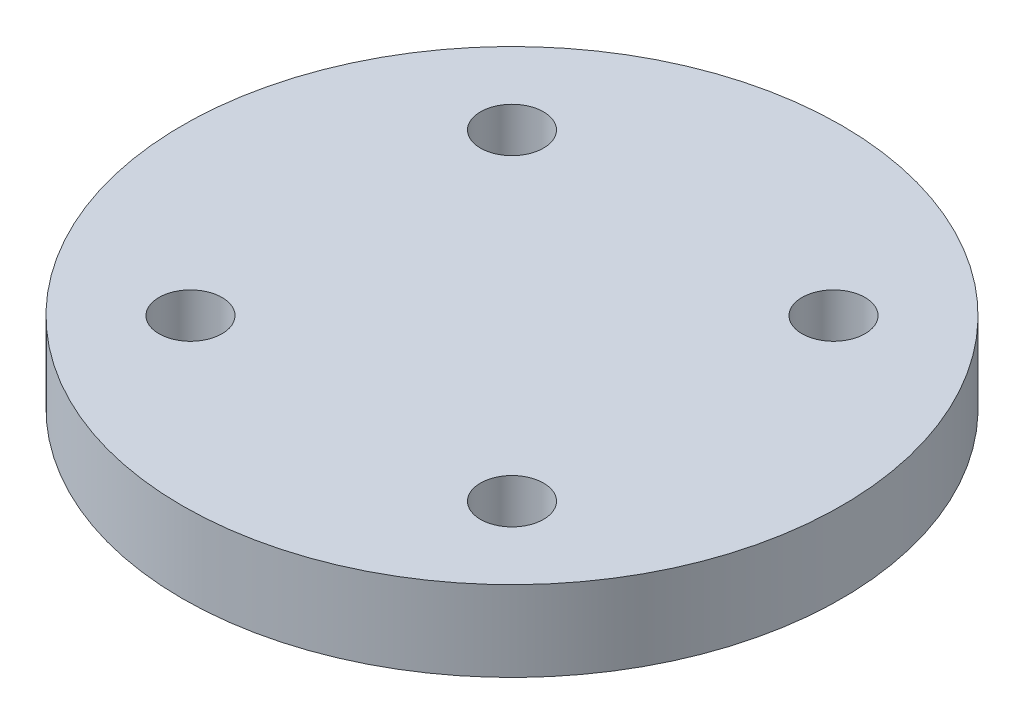
ISO-10303-21;
HEADER;
FILE_DESCRIPTION(('STEP AP214'),'2;1');
FILE_NAME('part.step','',(''),(''),'','','');
FILE_SCHEMA(('AUTOMOTIVE_DESIGN { 1 0 10303 214 1 1 1 1 }'));
ENDSEC;
DATA;
#1=APPLICATION_CONTEXT('core data for automotive mechanical design processes');
#2=APPLICATION_PROTOCOL_DEFINITION('international standard','automotive_design',2000,#1);
#3=PRODUCT_CONTEXT('',#1,'mechanical');
#4=PRODUCT('Part','Part','',(#3));
#5=PRODUCT_RELATED_PRODUCT_CATEGORY('part','',(#4));
#6=PRODUCT_DEFINITION_FORMATION('','',#4);
#7=PRODUCT_DEFINITION_CONTEXT('part definition',#1,'design');
#8=PRODUCT_DEFINITION('design','',#6,#7);
#9=PRODUCT_DEFINITION_SHAPE('','',#8);
#10=(LENGTH_UNIT() NAMED_UNIT(*) SI_UNIT(.MILLI.,.METRE.));
#11=(NAMED_UNIT(*) PLANE_ANGLE_UNIT() SI_UNIT($,.RADIAN.));
#12=(NAMED_UNIT(*) SI_UNIT($,.STERADIAN.) SOLID_ANGLE_UNIT());
#13=UNCERTAINTY_MEASURE_WITH_UNIT(LENGTH_MEASURE(1.E-05),#10,'distance_accuracy_value','');
#14=(GEOMETRIC_REPRESENTATION_CONTEXT(3) GLOBAL_UNCERTAINTY_ASSIGNED_CONTEXT((#13)) GLOBAL_UNIT_ASSIGNED_CONTEXT((#10,
#11,#12)) REPRESENTATION_CONTEXT('',''));
#15=CARTESIAN_POINT('',(0.,0.,0.));
#16=DIRECTION('',(0.,0.,1.));
#17=DIRECTION('',(1.,0.,0.));
#18=AXIS2_PLACEMENT_3D('',#15,#16,#17);
#19=CARTESIAN_POINT('',(0.,6.35,0.));
#20=DIRECTION('',(0.,1.,0.));
#21=DIRECTION('',(0.,0.,1.));
#22=AXIS2_PLACEMENT_3D('',#19,#20,#21);
#23=PLANE('',#22);
#24=CARTESIAN_POINT('',(12.7,6.35,12.7));
#25=DIRECTION('',(0.,1.,0.));
#26=DIRECTION('',(0.,0.,1.));
#27=AXIS2_PLACEMENT_3D('',#24,#25,#26);
#28=CIRCLE('',#27,2.4892);
#29=CARTESIAN_POINT('',(12.7,6.35,15.1892));
#30=VERTEX_POINT('',#29);
#31=EDGE_CURVE('E62',#30,#30,#28,.T.);
#32=ORIENTED_EDGE('',*,*,#31,.F.);
#33=EDGE_LOOP('',(#32));
#34=FACE_BOUND('',#33,.T.);
#35=CARTESIAN_POINT('',(-12.7,6.35,-12.7));
#36=DIRECTION('',(0.,1.,0.));
#37=DIRECTION('',(0.,0.,1.));
#38=AXIS2_PLACEMENT_3D('',#35,#36,#37);
#39=CIRCLE('',#38,2.4892);
#40=CARTESIAN_POINT('',(-12.7,6.35,-10.2108));
#41=VERTEX_POINT('',#40);
#42=EDGE_CURVE('E50',#41,#41,#39,.T.);
#43=ORIENTED_EDGE('',*,*,#42,.F.);
#44=EDGE_LOOP('',(#43));
#45=FACE_BOUND('',#44,.T.);
#46=CARTESIAN_POINT('',(0.,6.35,0.));
#47=DIRECTION('',(0.,1.,0.));
#48=DIRECTION('',(0.,0.,1.));
#49=AXIS2_PLACEMENT_3D('',#46,#47,#48);
#50=CIRCLE('',#49,26.035);
#51=CARTESIAN_POINT('',(0.,6.35,26.035));
#52=VERTEX_POINT('',#51);
#53=EDGE_CURVE('E11',#52,#52,#50,.T.);
#54=ORIENTED_EDGE('',*,*,#53,.T.);
#55=EDGE_LOOP('',(#54));
#56=FACE_BOUND('',#55,.T.);
#57=CARTESIAN_POINT('',(-12.7,6.35,12.7));
#58=DIRECTION('',(0.,1.,0.));
#59=DIRECTION('',(0.,0.,1.));
#60=AXIS2_PLACEMENT_3D('',#57,#58,#59);
#61=CIRCLE('',#60,2.4892);
#62=CARTESIAN_POINT('',(-12.7,6.35,15.1892));
#63=VERTEX_POINT('',#62);
#64=EDGE_CURVE('E56',#63,#63,#61,.T.);
#65=ORIENTED_EDGE('',*,*,#64,.F.);
#66=EDGE_LOOP('',(#65));
#67=FACE_BOUND('',#66,.T.);
#68=CARTESIAN_POINT('',(12.7,6.35,-12.7));
#69=DIRECTION('',(0.,1.,0.));
#70=DIRECTION('',(0.,0.,1.));
#71=AXIS2_PLACEMENT_3D('',#68,#69,#70);
#72=CIRCLE('',#71,2.4892);
#73=CARTESIAN_POINT('',(12.7,6.35,-10.2108));
#74=VERTEX_POINT('',#73);
#75=EDGE_CURVE('E68',#74,#74,#72,.T.);
#76=ORIENTED_EDGE('',*,*,#75,.F.);
#77=EDGE_LOOP('',(#76));
#78=FACE_BOUND('',#77,.T.);
#79=ADVANCED_FACE('F39',(#34,#45,#56,#67,#78),#23,.T.);
#80=CARTESIAN_POINT('',(0.,0.,0.));
#81=DIRECTION('',(0.,1.,0.));
#82=DIRECTION('',(0.,0.,1.));
#83=AXIS2_PLACEMENT_3D('',#80,#81,#82);
#84=PLANE('',#83);
#85=CARTESIAN_POINT('',(0.,0.,0.));
#86=DIRECTION('',(0.,1.,0.));
#87=DIRECTION('',(0.,0.,1.));
#88=AXIS2_PLACEMENT_3D('',#85,#86,#87);
#89=CIRCLE('',#88,26.035);
#90=CARTESIAN_POINT('',(0.,0.,26.035));
#91=VERTEX_POINT('',#90);
#92=EDGE_CURVE('E43',#91,#91,#89,.T.);
#93=ORIENTED_EDGE('',*,*,#92,.F.);
#94=EDGE_LOOP('',(#93));
#95=FACE_BOUND('',#94,.T.);
#96=CARTESIAN_POINT('',(-12.7,0.,-12.7));
#97=DIRECTION('',(0.,1.,0.));
#98=DIRECTION('',(0.,0.,1.));
#99=AXIS2_PLACEMENT_3D('',#96,#97,#98);
#100=CIRCLE('',#99,2.4892);
#101=CARTESIAN_POINT('',(-12.7,0.,-10.2108));
#102=VERTEX_POINT('',#101);
#103=EDGE_CURVE('E53',#102,#102,#100,.T.);
#104=ORIENTED_EDGE('',*,*,#103,.T.);
#105=EDGE_LOOP('',(#104));
#106=FACE_BOUND('',#105,.T.);
#107=CARTESIAN_POINT('',(-12.7,0.,12.7));
#108=DIRECTION('',(0.,1.,0.));
#109=DIRECTION('',(0.,0.,1.));
#110=AXIS2_PLACEMENT_3D('',#107,#108,#109);
#111=CIRCLE('',#110,2.4892);
#112=CARTESIAN_POINT('',(-12.7,0.,15.1892));
#113=VERTEX_POINT('',#112);
#114=EDGE_CURVE('E59',#113,#113,#111,.T.);
#115=ORIENTED_EDGE('',*,*,#114,.T.);
#116=EDGE_LOOP('',(#115));
#117=FACE_BOUND('',#116,.T.);
#118=CARTESIAN_POINT('',(12.7,0.,12.7));
#119=DIRECTION('',(0.,1.,0.));
#120=DIRECTION('',(0.,0.,1.));
#121=AXIS2_PLACEMENT_3D('',#118,#119,#120);
#122=CIRCLE('',#121,2.4892);
#123=CARTESIAN_POINT('',(12.7,0.,15.1892));
#124=VERTEX_POINT('',#123);
#125=EDGE_CURVE('E65',#124,#124,#122,.T.);
#126=ORIENTED_EDGE('',*,*,#125,.T.);
#127=EDGE_LOOP('',(#126));
#128=FACE_BOUND('',#127,.T.);
#129=CARTESIAN_POINT('',(12.7,0.,-12.7));
#130=DIRECTION('',(0.,1.,0.));
#131=DIRECTION('',(0.,0.,1.));
#132=AXIS2_PLACEMENT_3D('',#129,#130,#131);
#133=CIRCLE('',#132,2.4892);
#134=CARTESIAN_POINT('',(12.7,0.,-10.2108));
#135=VERTEX_POINT('',#134);
#136=EDGE_CURVE('E71',#135,#135,#133,.T.);
#137=ORIENTED_EDGE('',*,*,#136,.T.);
#138=EDGE_LOOP('',(#137));
#139=FACE_BOUND('',#138,.T.);
#140=ADVANCED_FACE('F81',(#95,#106,#117,#128,#139),#84,.F.);
#141=CARTESIAN_POINT('',(0.,6.35,0.));
#142=DIRECTION('',(0.,-1.,0.));
#143=DIRECTION('',(0.,0.,-1.));
#144=AXIS2_PLACEMENT_3D('',#141,#142,#143);
#145=CYLINDRICAL_SURFACE('',#144,26.035);
#146=ORIENTED_EDGE('',*,*,#53,.F.);
#147=EDGE_LOOP('',(#146));
#148=FACE_BOUND('',#147,.T.);
#149=ORIENTED_EDGE('',*,*,#92,.T.);
#150=EDGE_LOOP('',(#149));
#151=FACE_BOUND('',#150,.T.);
#152=ADVANCED_FACE('F41',(#148,#151),#145,.T.);
#153=CARTESIAN_POINT('',(-12.7,6.35,-12.7));
#154=DIRECTION('',(0.,-1.,0.));
#155=DIRECTION('',(0.,0.,-1.));
#156=AXIS2_PLACEMENT_3D('',#153,#154,#155);
#157=CYLINDRICAL_SURFACE('',#156,2.4892);
#158=ORIENTED_EDGE('',*,*,#42,.T.);
#159=EDGE_LOOP('',(#158));
#160=FACE_BOUND('',#159,.T.);
#161=ORIENTED_EDGE('',*,*,#103,.F.);
#162=EDGE_LOOP('',(#161));
#163=FACE_BOUND('',#162,.T.);
#164=ADVANCED_FACE('F91',(#160,#163),#157,.F.);
#165=CARTESIAN_POINT('',(-12.7,6.35,12.7));
#166=DIRECTION('',(0.,-1.,0.));
#167=DIRECTION('',(0.,0.,-1.));
#168=AXIS2_PLACEMENT_3D('',#165,#166,#167);
#169=CYLINDRICAL_SURFACE('',#168,2.4892);
#170=ORIENTED_EDGE('',*,*,#64,.T.);
#171=EDGE_LOOP('',(#170));
#172=FACE_BOUND('',#171,.T.);
#173=ORIENTED_EDGE('',*,*,#114,.F.);
#174=EDGE_LOOP('',(#173));
#175=FACE_BOUND('',#174,.T.);
#176=ADVANCED_FACE('F94',(#172,#175),#169,.F.);
#177=CARTESIAN_POINT('',(12.7,6.35,12.7));
#178=DIRECTION('',(0.,-1.,0.));
#179=DIRECTION('',(0.,0.,-1.));
#180=AXIS2_PLACEMENT_3D('',#177,#178,#179);
#181=CYLINDRICAL_SURFACE('',#180,2.4892);
#182=ORIENTED_EDGE('',*,*,#31,.T.);
#183=EDGE_LOOP('',(#182));
#184=FACE_BOUND('',#183,.T.);
#185=ORIENTED_EDGE('',*,*,#125,.F.);
#186=EDGE_LOOP('',(#185));
#187=FACE_BOUND('',#186,.T.);
#188=ADVANCED_FACE('F98',(#184,#187),#181,.F.);
#189=CARTESIAN_POINT('',(12.7,6.35,-12.7));
#190=DIRECTION('',(0.,-1.,0.));
#191=DIRECTION('',(0.,0.,-1.));
#192=AXIS2_PLACEMENT_3D('',#189,#190,#191);
#193=CYLINDRICAL_SURFACE('',#192,2.4892);
#194=ORIENTED_EDGE('',*,*,#75,.T.);
#195=EDGE_LOOP('',(#194));
#196=FACE_BOUND('',#195,.T.);
#197=ORIENTED_EDGE('',*,*,#136,.F.);
#198=EDGE_LOOP('',(#197));
#199=FACE_BOUND('',#198,.T.);
#200=ADVANCED_FACE('F77',(#196,#199),#193,.F.);
#201=CLOSED_SHELL('',(#79,#140,#152,#164,#176,#188,#200));
#202=MANIFOLD_SOLID_BREP('B2',#201);
#203=ADVANCED_BREP_SHAPE_REPRESENTATION('',(#18,#202),#14);
#204=SHAPE_DEFINITION_REPRESENTATION(#9,#203);
ENDSEC;
END-ISO-10303-21;
